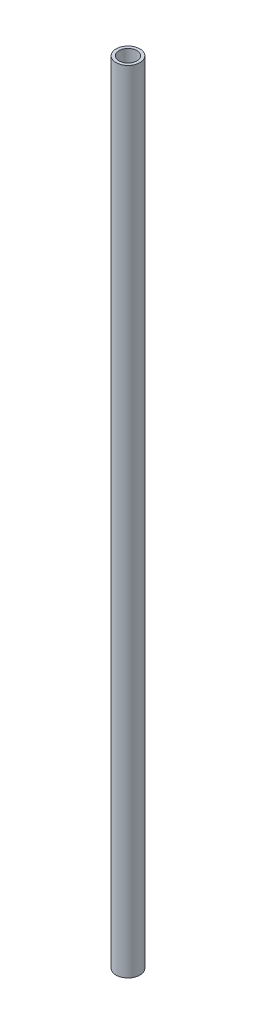
ISO-10303-21;
HEADER;
FILE_DESCRIPTION(('STEP AP214'),'2;1');
FILE_NAME('part.step','',(''),(''),'','','');
FILE_SCHEMA(('AUTOMOTIVE_DESIGN { 1 0 10303 214 1 1 1 1 }'));
ENDSEC;
DATA;
#1=APPLICATION_CONTEXT('core data for automotive mechanical design processes');
#2=APPLICATION_PROTOCOL_DEFINITION('international standard','automotive_design',2000,#1);
#3=PRODUCT_CONTEXT('',#1,'mechanical');
#4=PRODUCT('Part','Part','',(#3));
#5=PRODUCT_RELATED_PRODUCT_CATEGORY('part','',(#4));
#6=PRODUCT_DEFINITION_FORMATION('','',#4);
#7=PRODUCT_DEFINITION_CONTEXT('part definition',#1,'design');
#8=PRODUCT_DEFINITION('design','',#6,#7);
#9=PRODUCT_DEFINITION_SHAPE('','',#8);
#10=(LENGTH_UNIT() NAMED_UNIT(*) SI_UNIT(.MILLI.,.METRE.));
#11=(NAMED_UNIT(*) PLANE_ANGLE_UNIT() SI_UNIT($,.RADIAN.));
#12=(NAMED_UNIT(*) SI_UNIT($,.STERADIAN.) SOLID_ANGLE_UNIT());
#13=UNCERTAINTY_MEASURE_WITH_UNIT(LENGTH_MEASURE(1.E-05),#10,'distance_accuracy_value','');
#14=(GEOMETRIC_REPRESENTATION_CONTEXT(3) GLOBAL_UNCERTAINTY_ASSIGNED_CONTEXT((#13)) GLOBAL_UNIT_ASSIGNED_CONTEXT((#10,
#11,#12)) REPRESENTATION_CONTEXT('',''));
#15=CARTESIAN_POINT('',(0.,0.,0.));
#16=DIRECTION('',(0.,0.,1.));
#17=DIRECTION('',(1.,0.,0.));
#18=AXIS2_PLACEMENT_3D('',#15,#16,#17);
#19=CARTESIAN_POINT('',(0.,265.,0.));
#20=DIRECTION('',(0.,1.,0.));
#21=DIRECTION('',(0.,0.,1.));
#22=AXIS2_PLACEMENT_3D('',#19,#20,#21);
#23=PLANE('',#22);
#24=CARTESIAN_POINT('',(0.,265.,0.));
#25=DIRECTION('',(0.,1.,0.));
#26=DIRECTION('',(0.,0.,1.));
#27=AXIS2_PLACEMENT_3D('',#24,#25,#26);
#28=CIRCLE('',#27,4.);
#29=CARTESIAN_POINT('',(0.,265.,4.));
#30=VERTEX_POINT('',#29);
#31=EDGE_CURVE('E10',#30,#30,#28,.T.);
#32=ORIENTED_EDGE('',*,*,#31,.T.);
#33=EDGE_LOOP('',(#32));
#34=FACE_BOUND('',#33,.T.);
#35=CARTESIAN_POINT('',(0.,265.,0.));
#36=DIRECTION('',(0.,1.,0.));
#37=DIRECTION('',(0.,0.,1.));
#38=AXIS2_PLACEMENT_3D('',#35,#36,#37);
#39=CIRCLE('',#38,3.);
#40=CARTESIAN_POINT('',(0.,265.,3.));
#41=VERTEX_POINT('',#40);
#42=EDGE_CURVE('E44',#41,#41,#39,.T.);
#43=ORIENTED_EDGE('',*,*,#42,.F.);
#44=EDGE_LOOP('',(#43));
#45=FACE_BOUND('',#44,.T.);
#46=ADVANCED_FACE('F33',(#34,#45),#23,.T.);
#47=CARTESIAN_POINT('',(0.,0.,0.));
#48=DIRECTION('',(0.,1.,0.));
#49=DIRECTION('',(0.,0.,1.));
#50=AXIS2_PLACEMENT_3D('',#47,#48,#49);
#51=PLANE('',#50);
#52=CARTESIAN_POINT('',(0.,0.,0.));
#53=DIRECTION('',(0.,1.,0.));
#54=DIRECTION('',(0.,0.,1.));
#55=AXIS2_PLACEMENT_3D('',#52,#53,#54);
#56=CIRCLE('',#55,4.);
#57=CARTESIAN_POINT('',(0.,0.,4.));
#58=VERTEX_POINT('',#57);
#59=EDGE_CURVE('E37',#58,#58,#56,.T.);
#60=ORIENTED_EDGE('',*,*,#59,.F.);
#61=EDGE_LOOP('',(#60));
#62=FACE_BOUND('',#61,.T.);
#63=CARTESIAN_POINT('',(0.,0.,0.));
#64=DIRECTION('',(0.,1.,0.));
#65=DIRECTION('',(0.,0.,1.));
#66=AXIS2_PLACEMENT_3D('',#63,#64,#65);
#67=CIRCLE('',#66,3.);
#68=CARTESIAN_POINT('',(0.,0.,3.));
#69=VERTEX_POINT('',#68);
#70=EDGE_CURVE('E46',#69,#69,#67,.T.);
#71=ORIENTED_EDGE('',*,*,#70,.T.);
#72=EDGE_LOOP('',(#71));
#73=FACE_BOUND('',#72,.T.);
#74=ADVANCED_FACE('F56',(#62,#73),#51,.F.);
#75=CARTESIAN_POINT('',(0.,265.,0.));
#76=DIRECTION('',(0.,-1.,0.));
#77=DIRECTION('',(0.,0.,-1.));
#78=AXIS2_PLACEMENT_3D('',#75,#76,#77);
#79=CYLINDRICAL_SURFACE('',#78,4.);
#80=ORIENTED_EDGE('',*,*,#31,.F.);
#81=EDGE_LOOP('',(#80));
#82=FACE_BOUND('',#81,.T.);
#83=ORIENTED_EDGE('',*,*,#59,.T.);
#84=EDGE_LOOP('',(#83));
#85=FACE_BOUND('',#84,.T.);
#86=ADVANCED_FACE('F35',(#82,#85),#79,.T.);
#87=CARTESIAN_POINT('',(0.,265.,0.));
#88=DIRECTION('',(0.,-1.,0.));
#89=DIRECTION('',(0.,0.,-1.));
#90=AXIS2_PLACEMENT_3D('',#87,#88,#89);
#91=CYLINDRICAL_SURFACE('',#90,3.);
#92=ORIENTED_EDGE('',*,*,#42,.T.);
#93=EDGE_LOOP('',(#92));
#94=FACE_BOUND('',#93,.T.);
#95=ORIENTED_EDGE('',*,*,#70,.F.);
#96=EDGE_LOOP('',(#95));
#97=FACE_BOUND('',#96,.T.);
#98=ADVANCED_FACE('F52',(#94,#97),#91,.F.);
#99=CLOSED_SHELL('',(#46,#74,#86,#98));
#100=MANIFOLD_SOLID_BREP('B2',#99);
#101=ADVANCED_BREP_SHAPE_REPRESENTATION('',(#18,#100),#14);
#102=SHAPE_DEFINITION_REPRESENTATION(#9,#101);
ENDSEC;
END-ISO-10303-21;
